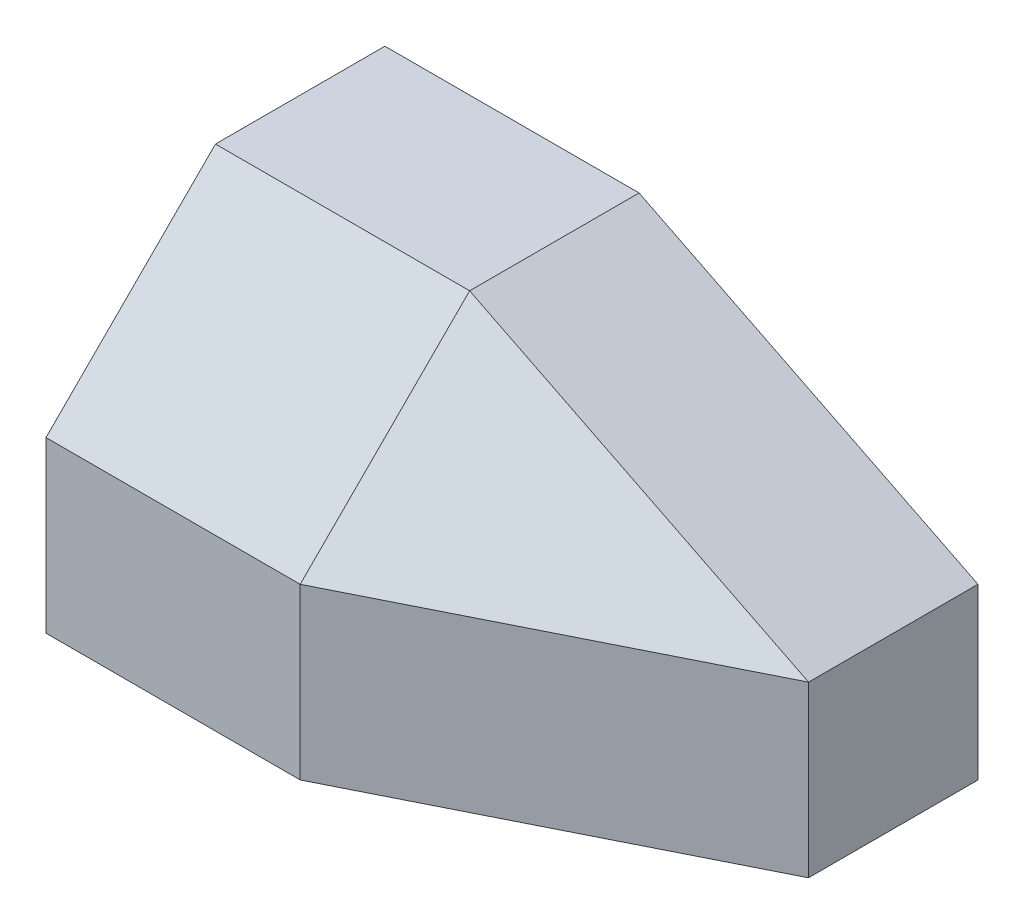
ISO-10303-21;
HEADER;
FILE_DESCRIPTION(('STEP AP214'),'2;1');
FILE_NAME('part.step','',(''),(''),'','','');
FILE_SCHEMA(('AUTOMOTIVE_DESIGN { 1 0 10303 214 1 1 1 1 }'));
ENDSEC;
DATA;
#1=APPLICATION_CONTEXT('core data for automotive mechanical design processes');
#2=APPLICATION_PROTOCOL_DEFINITION('international standard','automotive_design',2000,#1);
#3=PRODUCT_CONTEXT('',#1,'mechanical');
#4=PRODUCT('Part','Part','',(#3));
#5=PRODUCT_RELATED_PRODUCT_CATEGORY('part','',(#4));
#6=PRODUCT_DEFINITION_FORMATION('','',#4);
#7=PRODUCT_DEFINITION_CONTEXT('part definition',#1,'design');
#8=PRODUCT_DEFINITION('design','',#6,#7);
#9=PRODUCT_DEFINITION_SHAPE('','',#8);
#10=(LENGTH_UNIT() NAMED_UNIT(*) SI_UNIT(.MILLI.,.METRE.));
#11=(NAMED_UNIT(*) PLANE_ANGLE_UNIT() SI_UNIT($,.RADIAN.));
#12=(NAMED_UNIT(*) SI_UNIT($,.STERADIAN.) SOLID_ANGLE_UNIT());
#13=UNCERTAINTY_MEASURE_WITH_UNIT(LENGTH_MEASURE(1.E-05),#10,'distance_accuracy_value','');
#14=(GEOMETRIC_REPRESENTATION_CONTEXT(3) GLOBAL_UNCERTAINTY_ASSIGNED_CONTEXT((#13)) GLOBAL_UNIT_ASSIGNED_CONTEXT((#10,
#11,#12)) REPRESENTATION_CONTEXT('',''));
#15=CARTESIAN_POINT('',(0.,0.,0.));
#16=DIRECTION('',(0.,0.,1.));
#17=DIRECTION('',(1.,0.,0.));
#18=AXIS2_PLACEMENT_3D('',#15,#16,#17);
#19=CARTESIAN_POINT('',(35.,20.,-10.));
#20=DIRECTION('',(-1.,0.,0.));
#21=DIRECTION('',(0.,0.,1.));
#22=AXIS2_PLACEMENT_3D('',#19,#20,#21);
#23=PLANE('',#22);
#24=DIRECTION('',(0.,0.,-1.));
#25=VECTOR('',#24,1.);
#26=CARTESIAN_POINT('',(35.,0.,-10.));
#27=LINE('',#26,#25);
#28=CARTESIAN_POINT('',(35.,0.,10.));
#29=VERTEX_POINT('',#28);
#30=CARTESIAN_POINT('',(35.,0.,-10.));
#31=VERTEX_POINT('',#30);
#32=EDGE_CURVE('E148',#29,#31,#27,.T.);
#33=ORIENTED_EDGE('',*,*,#32,.T.);
#34=DIRECTION('',(0.,-1.,0.));
#35=VECTOR('',#34,1.);
#36=CARTESIAN_POINT('',(35.,20.,-10.));
#37=LINE('',#36,#35);
#38=CARTESIAN_POINT('',(35.,20.,-10.));
#39=VERTEX_POINT('',#38);
#40=EDGE_CURVE('E12',#39,#31,#37,.T.);
#41=ORIENTED_EDGE('',*,*,#40,.F.);
#42=DIRECTION('',(0.,0.,-1.));
#43=VECTOR('',#42,1.);
#44=CARTESIAN_POINT('',(35.,20.,-10.));
#45=LINE('',#44,#43);
#46=CARTESIAN_POINT('',(35.,20.,10.));
#47=VERTEX_POINT('',#46);
#48=EDGE_CURVE('E142',#47,#39,#45,.T.);
#49=ORIENTED_EDGE('',*,*,#48,.F.);
#50=DIRECTION('',(0.,-1.,0.));
#51=VECTOR('',#50,1.);
#52=CARTESIAN_POINT('',(35.,20.,10.));
#53=LINE('',#52,#51);
#54=EDGE_CURVE('E122',#47,#29,#53,.T.);
#55=ORIENTED_EDGE('',*,*,#54,.T.);
#56=EDGE_LOOP('',(#33,#41,#49,#55));
#57=FACE_BOUND('',#56,.T.);
#58=ADVANCED_FACE('F37',(#57),#23,.F.);
#59=CARTESIAN_POINT('',(-35.,20.,-10.));
#60=DIRECTION('',(0.,0.,1.));
#61=DIRECTION('',(1.,0.,0.));
#62=AXIS2_PLACEMENT_3D('',#59,#60,#61);
#63=PLANE('',#62);
#64=DIRECTION('',(-1.,0.,0.));
#65=VECTOR('',#64,1.);
#66=CARTESIAN_POINT('',(-35.,0.,-10.));
#67=LINE('',#66,#65);
#68=CARTESIAN_POINT('',(-35.,0.,-10.));
#69=VERTEX_POINT('',#68);
#70=EDGE_CURVE('E64',#31,#69,#67,.T.);
#71=ORIENTED_EDGE('',*,*,#70,.T.);
#72=DIRECTION('',(0.,-1.,0.));
#73=VECTOR('',#72,1.);
#74=CARTESIAN_POINT('',(-35.,20.,-10.));
#75=LINE('',#74,#73);
#76=CARTESIAN_POINT('',(-35.,40.,-10.));
#77=VERTEX_POINT('',#76);
#78=EDGE_CURVE('E46',#77,#69,#75,.T.);
#79=ORIENTED_EDGE('',*,*,#78,.F.);
#80=DIRECTION('',(-1.,0.,0.));
#81=VECTOR('',#80,1.);
#82=CARTESIAN_POINT('',(-35.,40.,-10.));
#83=LINE('',#82,#81);
#84=CARTESIAN_POINT('',(-5.,40.,-10.));
#85=VERTEX_POINT('',#84);
#86=EDGE_CURVE('E156',#85,#77,#83,.T.);
#87=ORIENTED_EDGE('',*,*,#86,.F.);
#88=DIRECTION('',(-0.894427190999916,0.447213595499958,0.));
#89=VECTOR('',#88,1.);
#90=CARTESIAN_POINT('',(-5.,40.,-10.));
#91=LINE('',#90,#89);
#92=EDGE_CURVE('E161',#39,#85,#91,.T.);
#93=ORIENTED_EDGE('',*,*,#92,.F.);
#94=ORIENTED_EDGE('',*,*,#40,.T.);
#95=EDGE_LOOP('',(#71,#79,#87,#93,#94));
#96=FACE_BOUND('',#95,.T.);
#97=ADVANCED_FACE('F182',(#96),#63,.F.);
#98=CARTESIAN_POINT('',(-35.,20.,-10.));
#99=DIRECTION('',(1.,0.,0.));
#100=DIRECTION('',(0.,0.,-1.));
#101=AXIS2_PLACEMENT_3D('',#98,#99,#100);
#102=PLANE('',#101);
#103=DIRECTION('',(0.,0.,1.));
#104=VECTOR('',#103,1.);
#105=CARTESIAN_POINT('',(-35.,0.,-10.));
#106=LINE('',#105,#104);
#107=CARTESIAN_POINT('',(-35.,0.,30.));
#108=VERTEX_POINT('',#107);
#109=EDGE_CURVE('E89',#69,#108,#106,.T.);
#110=ORIENTED_EDGE('',*,*,#109,.T.);
#111=DIRECTION('',(0.,-1.,0.));
#112=VECTOR('',#111,1.);
#113=CARTESIAN_POINT('',(-35.,20.,30.));
#114=LINE('',#113,#112);
#115=CARTESIAN_POINT('',(-35.,20.,30.));
#116=VERTEX_POINT('',#115);
#117=EDGE_CURVE('E123',#116,#108,#114,.T.);
#118=ORIENTED_EDGE('',*,*,#117,.F.);
#119=DIRECTION('',(0.,0.707106781186548,-0.707106781186548));
#120=VECTOR('',#119,1.);
#121=CARTESIAN_POINT('',(-35.,40.,10.));
#122=LINE('',#121,#120);
#123=CARTESIAN_POINT('',(-35.,40.,10.));
#124=VERTEX_POINT('',#123);
#125=EDGE_CURVE('E113',#116,#124,#122,.T.);
#126=ORIENTED_EDGE('',*,*,#125,.T.);
#127=DIRECTION('',(0.,0.,1.));
#128=VECTOR('',#127,1.);
#129=CARTESIAN_POINT('',(-35.,40.,-10.));
#130=LINE('',#129,#128);
#131=EDGE_CURVE('E155',#77,#124,#130,.T.);
#132=ORIENTED_EDGE('',*,*,#131,.F.);
#133=ORIENTED_EDGE('',*,*,#78,.T.);
#134=EDGE_LOOP('',(#110,#118,#126,#132,#133));
#135=FACE_BOUND('',#134,.T.);
#136=ADVANCED_FACE('F179',(#135),#102,.F.);
#137=CARTESIAN_POINT('',(0.,0.,0.));
#138=DIRECTION('',(0.,1.,0.));
#139=DIRECTION('',(0.,0.,1.));
#140=AXIS2_PLACEMENT_3D('',#137,#138,#139);
#141=PLANE('',#140);
#142=ORIENTED_EDGE('',*,*,#32,.F.);
#143=DIRECTION('',(0.894427190999916,0.,-0.447213595499958));
#144=VECTOR('',#143,1.);
#145=CARTESIAN_POINT('',(-5.,0.,30.));
#146=LINE('',#145,#144);
#147=CARTESIAN_POINT('',(-5.,0.,30.));
#148=VERTEX_POINT('',#147);
#149=EDGE_CURVE('E133',#148,#29,#146,.T.);
#150=ORIENTED_EDGE('',*,*,#149,.F.);
#151=DIRECTION('',(1.,0.,0.));
#152=VECTOR('',#151,1.);
#153=CARTESIAN_POINT('',(-35.,0.,30.));
#154=LINE('',#153,#152);
#155=EDGE_CURVE('E112',#108,#148,#154,.T.);
#156=ORIENTED_EDGE('',*,*,#155,.F.);
#157=ORIENTED_EDGE('',*,*,#109,.F.);
#158=ORIENTED_EDGE('',*,*,#70,.F.);
#159=EDGE_LOOP('',(#142,#150,#156,#157,#158));
#160=FACE_BOUND('',#159,.T.);
#161=ADVANCED_FACE('F176',(#160),#141,.F.);
#162=CARTESIAN_POINT('',(-35.,40.,-10.));
#163=DIRECTION('',(0.,1.,0.));
#164=DIRECTION('',(0.,0.,1.));
#165=AXIS2_PLACEMENT_3D('',#162,#163,#164);
#166=PLANE('',#165);
#167=DIRECTION('',(-1.,0.,0.));
#168=VECTOR('',#167,1.);
#169=CARTESIAN_POINT('',(-35.,40.,10.));
#170=LINE('',#169,#168);
#171=CARTESIAN_POINT('',(-5.,40.,10.));
#172=VERTEX_POINT('',#171);
#173=EDGE_CURVE('E159',#172,#124,#170,.T.);
#174=ORIENTED_EDGE('',*,*,#173,.F.);
#175=DIRECTION('',(0.,0.,1.));
#176=VECTOR('',#175,1.);
#177=CARTESIAN_POINT('',(-5.,40.,-10.));
#178=LINE('',#177,#176);
#179=EDGE_CURVE('E153',#85,#172,#178,.T.);
#180=ORIENTED_EDGE('',*,*,#179,.F.);
#181=ORIENTED_EDGE('',*,*,#86,.T.);
#182=ORIENTED_EDGE('',*,*,#131,.T.);
#183=EDGE_LOOP('',(#174,#180,#181,#182));
#184=FACE_BOUND('',#183,.T.);
#185=ADVANCED_FACE('F181',(#184),#166,.T.);
#186=CARTESIAN_POINT('',(-5.,40.,-10.));
#187=DIRECTION('',(0.447213595499958,0.894427190999916,0.));
#188=DIRECTION('',(-0.894427190999916,0.447213595499958,0.));
#189=AXIS2_PLACEMENT_3D('',#186,#187,#188);
#190=PLANE('',#189);
#191=DIRECTION('',(-0.894427190999916,0.447213595499958,0.));
#192=VECTOR('',#191,1.);
#193=CARTESIAN_POINT('',(-5.,40.,10.));
#194=LINE('',#193,#192);
#195=EDGE_CURVE('E82',#47,#172,#194,.T.);
#196=ORIENTED_EDGE('',*,*,#195,.F.);
#197=ORIENTED_EDGE('',*,*,#48,.T.);
#198=ORIENTED_EDGE('',*,*,#92,.T.);
#199=ORIENTED_EDGE('',*,*,#179,.T.);
#200=EDGE_LOOP('',(#196,#197,#198,#199));
#201=FACE_BOUND('',#200,.T.);
#202=ADVANCED_FACE('F192',(#201),#190,.T.);
#203=CARTESIAN_POINT('',(-35.,20.,30.));
#204=DIRECTION('',(0.,0.,-1.));
#205=DIRECTION('',(-1.,0.,0.));
#206=AXIS2_PLACEMENT_3D('',#203,#204,#205);
#207=PLANE('',#206);
#208=ORIENTED_EDGE('',*,*,#155,.T.);
#209=DIRECTION('',(0.,-1.,0.));
#210=VECTOR('',#209,1.);
#211=CARTESIAN_POINT('',(-5.,20.,30.));
#212=LINE('',#211,#210);
#213=CARTESIAN_POINT('',(-5.,20.,30.));
#214=VERTEX_POINT('',#213);
#215=EDGE_CURVE('E119',#214,#148,#212,.T.);
#216=ORIENTED_EDGE('',*,*,#215,.F.);
#217=DIRECTION('',(1.,0.,0.));
#218=VECTOR('',#217,1.);
#219=CARTESIAN_POINT('',(-35.,20.,30.));
#220=LINE('',#219,#218);
#221=EDGE_CURVE('E124',#116,#214,#220,.T.);
#222=ORIENTED_EDGE('',*,*,#221,.F.);
#223=ORIENTED_EDGE('',*,*,#117,.T.);
#224=EDGE_LOOP('',(#208,#216,#222,#223));
#225=FACE_BOUND('',#224,.T.);
#226=ADVANCED_FACE('F127',(#225),#207,.F.);
#227=CARTESIAN_POINT('',(-5.,20.,30.));
#228=DIRECTION('',(-0.447213595499958,0.,-0.894427190999916));
#229=DIRECTION('',(-0.894427190999916,0.,0.447213595499958));
#230=AXIS2_PLACEMENT_3D('',#227,#228,#229);
#231=PLANE('',#230);
#232=ORIENTED_EDGE('',*,*,#149,.T.);
#233=ORIENTED_EDGE('',*,*,#54,.F.);
#234=DIRECTION('',(0.894427190999916,0.,-0.447213595499958));
#235=VECTOR('',#234,1.);
#236=CARTESIAN_POINT('',(-5.,20.,30.));
#237=LINE('',#236,#235);
#238=EDGE_CURVE('E107',#214,#47,#237,.T.);
#239=ORIENTED_EDGE('',*,*,#238,.F.);
#240=ORIENTED_EDGE('',*,*,#215,.T.);
#241=EDGE_LOOP('',(#232,#233,#239,#240));
#242=FACE_BOUND('',#241,.T.);
#243=ADVANCED_FACE('F118',(#242),#231,.F.);
#244=CARTESIAN_POINT('',(-5.,40.,9.99999999999998));
#245=DIRECTION('',(0.,0.707106781186548,0.707106781186548));
#246=DIRECTION('',(0.,-0.707106781186548,0.707106781186548));
#247=AXIS2_PLACEMENT_3D('',#244,#245,#246);
#248=PLANE('',#247);
#249=ORIENTED_EDGE('',*,*,#125,.F.);
#250=ORIENTED_EDGE('',*,*,#221,.T.);
#251=DIRECTION('',(0.,0.707106781186548,-0.707106781186548));
#252=VECTOR('',#251,1.);
#253=CARTESIAN_POINT('',(-5.,40.,9.99999999999998));
#254=LINE('',#253,#252);
#255=EDGE_CURVE('E104',#214,#172,#254,.T.);
#256=ORIENTED_EDGE('',*,*,#255,.T.);
#257=ORIENTED_EDGE('',*,*,#173,.T.);
#258=EDGE_LOOP('',(#249,#250,#256,#257));
#259=FACE_BOUND('',#258,.T.);
#260=ADVANCED_FACE('F131',(#259),#248,.T.);
#261=CARTESIAN_POINT('',(10.5555555555555,21.1111111111111,21.1111111111111));
#262=DIRECTION('',(0.333333333333333,0.666666666666667,0.666666666666667));
#263=DIRECTION('',(0.,-0.707106781186548,0.707106781186547));
#264=AXIS2_PLACEMENT_3D('',#261,#262,#263);
#265=PLANE('',#264);
#266=ORIENTED_EDGE('',*,*,#195,.T.);
#267=ORIENTED_EDGE('',*,*,#255,.F.);
#268=ORIENTED_EDGE('',*,*,#238,.T.);
#269=EDGE_LOOP('',(#266,#267,#268));
#270=FACE_BOUND('',#269,.T.);
#271=ADVANCED_FACE('F106',(#270),#265,.T.);
#272=CLOSED_SHELL('',(#58,#97,#136,#161,#185,#202,#226,#243,#260,#271));
#273=MANIFOLD_SOLID_BREP('B2',#272);
#274=ADVANCED_BREP_SHAPE_REPRESENTATION('',(#18,#273),#14);
#275=SHAPE_DEFINITION_REPRESENTATION(#9,#274);
ENDSEC;
END-ISO-10303-21;
